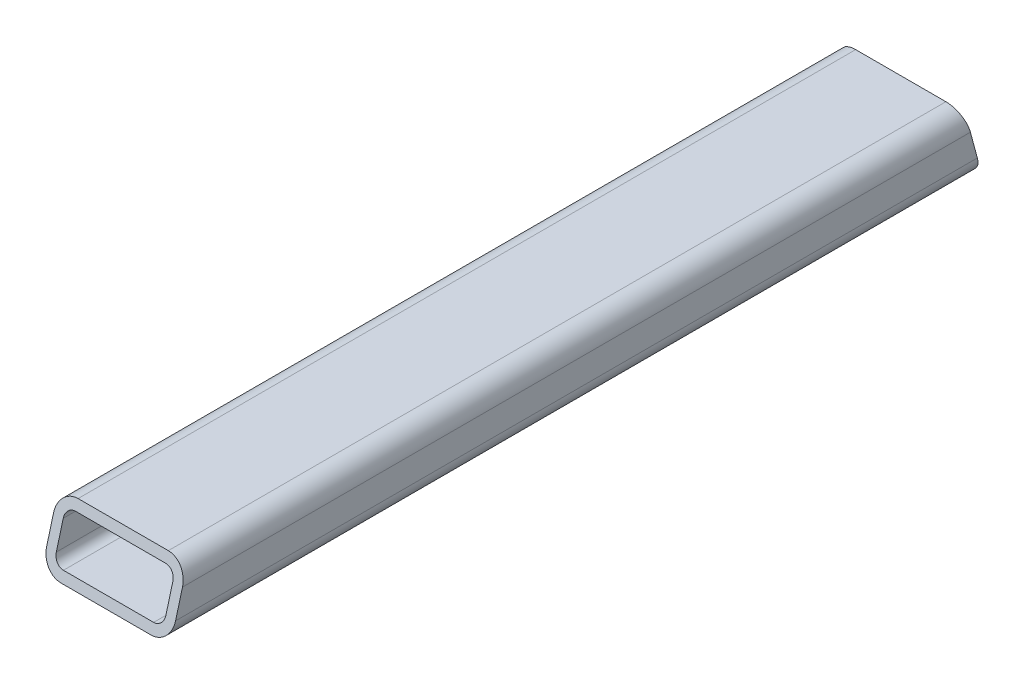
ISO-10303-21;
HEADER;
FILE_DESCRIPTION(('STEP AP214'),'2;1');
FILE_NAME('part.step','',(''),(''),'','','');
FILE_SCHEMA(('AUTOMOTIVE_DESIGN { 1 0 10303 214 1 1 1 1 }'));
ENDSEC;
DATA;
#1=APPLICATION_CONTEXT('core data for automotive mechanical design processes');
#2=APPLICATION_PROTOCOL_DEFINITION('international standard','automotive_design',2000,#1);
#3=PRODUCT_CONTEXT('',#1,'mechanical');
#4=PRODUCT('Part','Part','',(#3));
#5=PRODUCT_RELATED_PRODUCT_CATEGORY('part','',(#4));
#6=PRODUCT_DEFINITION_FORMATION('','',#4);
#7=PRODUCT_DEFINITION_CONTEXT('part definition',#1,'design');
#8=PRODUCT_DEFINITION('design','',#6,#7);
#9=PRODUCT_DEFINITION_SHAPE('','',#8);
#10=(LENGTH_UNIT() NAMED_UNIT(*) SI_UNIT(.MILLI.,.METRE.));
#11=(NAMED_UNIT(*) PLANE_ANGLE_UNIT() SI_UNIT($,.RADIAN.));
#12=(NAMED_UNIT(*) SI_UNIT($,.STERADIAN.) SOLID_ANGLE_UNIT());
#13=UNCERTAINTY_MEASURE_WITH_UNIT(LENGTH_MEASURE(1.E-05),#10,'distance_accuracy_value','');
#14=(GEOMETRIC_REPRESENTATION_CONTEXT(3) GLOBAL_UNCERTAINTY_ASSIGNED_CONTEXT((#13)) GLOBAL_UNIT_ASSIGNED_CONTEXT((#10,
#11,#12)) REPRESENTATION_CONTEXT('',''));
#15=CARTESIAN_POINT('',(0.,0.,0.));
#16=DIRECTION('',(0.,0.,1.));
#17=DIRECTION('',(1.,0.,0.));
#18=AXIS2_PLACEMENT_3D('',#15,#16,#17);
#19=CARTESIAN_POINT('',(14.,-4.,-126.));
#20=DIRECTION('',(0.,0.,1.));
#21=DIRECTION('',(1.,0.,0.));
#22=AXIS2_PLACEMENT_3D('',#19,#20,#21);
#23=CYLINDRICAL_SURFACE('',#22,6.);
#24=DIRECTION('',(0.,0.,1.));
#25=VECTOR('',#24,1.);
#26=CARTESIAN_POINT('',(14.,-10.,-126.));
#27=LINE('',#26,#25);
#28=CARTESIAN_POINT('',(14.,-10.,-126.));
#29=VERTEX_POINT('',#28);
#30=CARTESIAN_POINT('',(14.,-10.,126.));
#31=VERTEX_POINT('',#30);
#32=EDGE_CURVE('E129',#29,#31,#27,.T.);
#33=ORIENTED_EDGE('',*,*,#32,.F.);
#34=CARTESIAN_POINT('',(14.,-4.,-124.392304845413));
#35=DIRECTION('',(0.,0.258819045102517,-0.965925826289069));
#36=DIRECTION('',(0.,0.965925826289069,0.258819045102518));
#37=AXIS2_PLACEMENT_3D('',#34,#35,#36);
#38=ELLIPSE('',#37,6.21165708246049,6.);
#39=CARTESIAN_POINT('',(20.,-3.99999999999996,-124.392304845413));
#40=VERTEX_POINT('',#39);
#41=EDGE_CURVE('E169',#29,#40,#38,.F.);
#42=ORIENTED_EDGE('',*,*,#41,.T.);
#43=DIRECTION('',(0.,0.,1.));
#44=VECTOR('',#43,1.);
#45=CARTESIAN_POINT('',(20.,-3.99999999999996,-126.));
#46=LINE('',#45,#44);
#47=CARTESIAN_POINT('',(20.,-3.99999999999996,124.392304845413));
#48=VERTEX_POINT('',#47);
#49=EDGE_CURVE('E161',#40,#48,#46,.T.);
#50=ORIENTED_EDGE('',*,*,#49,.T.);
#51=CARTESIAN_POINT('',(14.,-4.,124.392304845413));
#52=DIRECTION('',(0.,-0.258819045102518,-0.965925826289069));
#53=DIRECTION('',(0.,-0.965925826289069,0.258819045102518));
#54=AXIS2_PLACEMENT_3D('',#51,#52,#53);
#55=ELLIPSE('',#54,6.21165708246049,6.);
#56=EDGE_CURVE('E171',#48,#31,#55,.T.);
#57=ORIENTED_EDGE('',*,*,#56,.T.);
#58=EDGE_LOOP('',(#33,#42,#50,#57));
#59=FACE_BOUND('',#58,.T.);
#60=ADVANCED_FACE('F43',(#59),#23,.T.);
#61=CARTESIAN_POINT('',(-14.,-10.,-126.));
#62=DIRECTION('',(0.,-1.,0.));
#63=DIRECTION('',(0.,0.,-1.));
#64=AXIS2_PLACEMENT_3D('',#61,#62,#63);
#65=PLANE('',#64);
#66=ORIENTED_EDGE('',*,*,#32,.T.);
#67=DIRECTION('',(1.,0.,0.));
#68=VECTOR('',#67,1.);
#69=CARTESIAN_POINT('',(-14.,-10.,126.));
#70=LINE('',#69,#68);
#71=CARTESIAN_POINT('',(-14.,-10.,126.));
#72=VERTEX_POINT('',#71);
#73=EDGE_CURVE('E177',#72,#31,#70,.T.);
#74=ORIENTED_EDGE('',*,*,#73,.F.);
#75=DIRECTION('',(0.,0.,1.));
#76=VECTOR('',#75,1.);
#77=CARTESIAN_POINT('',(-14.,-10.,-126.));
#78=LINE('',#77,#76);
#79=CARTESIAN_POINT('',(-14.,-10.,-126.));
#80=VERTEX_POINT('',#79);
#81=EDGE_CURVE('E264',#80,#72,#78,.T.);
#82=ORIENTED_EDGE('',*,*,#81,.F.);
#83=DIRECTION('',(1.,0.,0.));
#84=VECTOR('',#83,1.);
#85=CARTESIAN_POINT('',(-14.,-10.,-126.));
#86=LINE('',#85,#84);
#87=EDGE_CURVE('E173',#80,#29,#86,.T.);
#88=ORIENTED_EDGE('',*,*,#87,.T.);
#89=EDGE_LOOP('',(#66,#74,#82,#88));
#90=FACE_BOUND('',#89,.T.);
#91=ADVANCED_FACE('F314',(#90),#65,.T.);
#92=CARTESIAN_POINT('',(-14.,-4.,-126.));
#93=DIRECTION('',(0.,0.,1.));
#94=DIRECTION('',(1.,0.,0.));
#95=AXIS2_PLACEMENT_3D('',#92,#93,#94);
#96=CYLINDRICAL_SURFACE('',#95,6.);
#97=DIRECTION('',(0.,0.,1.));
#98=VECTOR('',#97,1.);
#99=CARTESIAN_POINT('',(-20.,-3.99999999999996,-126.));
#100=LINE('',#99,#98);
#101=CARTESIAN_POINT('',(-20.,-3.99999999999996,-124.392304845413));
#102=VERTEX_POINT('',#101);
#103=CARTESIAN_POINT('',(-20.,-3.99999999999996,124.392304845413));
#104=VERTEX_POINT('',#103);
#105=EDGE_CURVE('E270',#102,#104,#100,.T.);
#106=ORIENTED_EDGE('',*,*,#105,.F.);
#107=CARTESIAN_POINT('',(-14.,-4.,-124.392304845413));
#108=DIRECTION('',(0.,0.258819045102517,-0.965925826289069));
#109=DIRECTION('',(0.,0.965925826289069,0.258819045102518));
#110=AXIS2_PLACEMENT_3D('',#107,#108,#109);
#111=ELLIPSE('',#110,6.21165708246049,6.);
#112=EDGE_CURVE('E179',#102,#80,#111,.F.);
#113=ORIENTED_EDGE('',*,*,#112,.T.);
#114=ORIENTED_EDGE('',*,*,#81,.T.);
#115=CARTESIAN_POINT('',(-14.,-4.,124.392304845413));
#116=DIRECTION('',(0.,-0.258819045102518,-0.965925826289069));
#117=DIRECTION('',(0.,-0.965925826289069,0.258819045102518));
#118=AXIS2_PLACEMENT_3D('',#115,#116,#117);
#119=ELLIPSE('',#118,6.21165708246049,6.);
#120=EDGE_CURVE('E182',#72,#104,#119,.T.);
#121=ORIENTED_EDGE('',*,*,#120,.T.);
#122=EDGE_LOOP('',(#106,#113,#114,#121));
#123=FACE_BOUND('',#122,.T.);
#124=ADVANCED_FACE('F292',(#123),#96,.T.);
#125=CARTESIAN_POINT('',(-20.,3.99999999999996,-126.));
#126=DIRECTION('',(-1.,0.,0.));
#127=DIRECTION('',(0.,0.,1.));
#128=AXIS2_PLACEMENT_3D('',#125,#126,#127);
#129=PLANE('',#128);
#130=DIRECTION('',(0.,0.,1.));
#131=VECTOR('',#130,1.);
#132=CARTESIAN_POINT('',(-20.,3.99999999999996,-126.));
#133=LINE('',#132,#131);
#134=CARTESIAN_POINT('',(-20.,3.99999999999996,-122.248711305964));
#135=VERTEX_POINT('',#134);
#136=CARTESIAN_POINT('',(-20.,3.99999999999996,122.248711305964));
#137=VERTEX_POINT('',#136);
#138=EDGE_CURVE('E269',#135,#137,#133,.T.);
#139=ORIENTED_EDGE('',*,*,#138,.F.);
#140=DIRECTION('',(0.,-0.965925826289069,-0.258819045102518));
#141=VECTOR('',#140,1.);
#142=CARTESIAN_POINT('',(-20.,3.06217782649103,-122.5));
#143=LINE('',#142,#141);
#144=EDGE_CURVE('E288',#135,#102,#143,.T.);
#145=ORIENTED_EDGE('',*,*,#144,.T.);
#146=ORIENTED_EDGE('',*,*,#105,.T.);
#147=DIRECTION('',(0.,-0.965925826289069,0.258819045102518));
#148=VECTOR('',#147,1.);
#149=CARTESIAN_POINT('',(-20.,66.0621778264904,105.61920087684));
#150=LINE('',#149,#148);
#151=EDGE_CURVE('E290',#104,#137,#150,.F.);
#152=ORIENTED_EDGE('',*,*,#151,.T.);
#153=EDGE_LOOP('',(#139,#145,#146,#152));
#154=FACE_BOUND('',#153,.T.);
#155=ADVANCED_FACE('F296',(#154),#129,.T.);
#156=CARTESIAN_POINT('',(-14.,4.,-126.));
#157=DIRECTION('',(0.,0.,1.));
#158=DIRECTION('',(1.,0.,0.));
#159=AXIS2_PLACEMENT_3D('',#156,#157,#158);
#160=CYLINDRICAL_SURFACE('',#159,6.);
#161=DIRECTION('',(0.,0.,1.));
#162=VECTOR('',#161,1.);
#163=CARTESIAN_POINT('',(-14.,10.,-126.));
#164=LINE('',#163,#162);
#165=CARTESIAN_POINT('',(-14.,10.,-120.641016151378));
#166=VERTEX_POINT('',#165);
#167=CARTESIAN_POINT('',(-14.,10.,120.641016151378));
#168=VERTEX_POINT('',#167);
#169=EDGE_CURVE('E271',#166,#168,#164,.T.);
#170=ORIENTED_EDGE('',*,*,#169,.F.);
#171=CARTESIAN_POINT('',(-14.,4.,-122.248711305964));
#172=DIRECTION('',(0.,0.258819045102517,-0.965925826289069));
#173=DIRECTION('',(0.,0.965925826289069,0.258819045102518));
#174=AXIS2_PLACEMENT_3D('',#171,#172,#173);
#175=ELLIPSE('',#174,6.21165708246049,6.);
#176=EDGE_CURVE('E282',#166,#135,#175,.F.);
#177=ORIENTED_EDGE('',*,*,#176,.T.);
#178=ORIENTED_EDGE('',*,*,#138,.T.);
#179=CARTESIAN_POINT('',(-14.,4.,122.248711305964));
#180=DIRECTION('',(0.,-0.258819045102518,-0.965925826289069));
#181=DIRECTION('',(0.,-0.965925826289069,0.258819045102518));
#182=AXIS2_PLACEMENT_3D('',#179,#180,#181);
#183=ELLIPSE('',#182,6.21165708246049,6.);
#184=EDGE_CURVE('E281',#137,#168,#183,.T.);
#185=ORIENTED_EDGE('',*,*,#184,.T.);
#186=EDGE_LOOP('',(#170,#177,#178,#185));
#187=FACE_BOUND('',#186,.T.);
#188=ADVANCED_FACE('F302',(#187),#160,.T.);
#189=CARTESIAN_POINT('',(-14.,10.,-126.));
#190=DIRECTION('',(0.,1.,0.));
#191=DIRECTION('',(0.,0.,1.));
#192=AXIS2_PLACEMENT_3D('',#189,#190,#191);
#193=PLANE('',#192);
#194=DIRECTION('',(0.,0.,1.));
#195=VECTOR('',#194,1.);
#196=CARTESIAN_POINT('',(14.,10.,-126.));
#197=LINE('',#196,#195);
#198=CARTESIAN_POINT('',(14.,10.,-120.641016151378));
#199=VERTEX_POINT('',#198);
#200=CARTESIAN_POINT('',(14.,10.,120.641016151378));
#201=VERTEX_POINT('',#200);
#202=EDGE_CURVE('E279',#199,#201,#197,.T.);
#203=ORIENTED_EDGE('',*,*,#202,.F.);
#204=DIRECTION('',(-1.,0.,0.));
#205=VECTOR('',#204,1.);
#206=CARTESIAN_POINT('',(-14.,10.,-120.641016151378));
#207=LINE('',#206,#205);
#208=EDGE_CURVE('E277',#199,#166,#207,.T.);
#209=ORIENTED_EDGE('',*,*,#208,.T.);
#210=ORIENTED_EDGE('',*,*,#169,.T.);
#211=DIRECTION('',(1.,0.,0.));
#212=VECTOR('',#211,1.);
#213=CARTESIAN_POINT('',(-14.,10.,120.641016151378));
#214=LINE('',#213,#212);
#215=EDGE_CURVE('E261',#168,#201,#214,.T.);
#216=ORIENTED_EDGE('',*,*,#215,.T.);
#217=EDGE_LOOP('',(#203,#209,#210,#216));
#218=FACE_BOUND('',#217,.T.);
#219=ADVANCED_FACE('F310',(#218),#193,.T.);
#220=CARTESIAN_POINT('',(14.,4.,-126.));
#221=DIRECTION('',(0.,0.,1.));
#222=DIRECTION('',(1.,0.,0.));
#223=AXIS2_PLACEMENT_3D('',#220,#221,#222);
#224=CYLINDRICAL_SURFACE('',#223,6.);
#225=DIRECTION('',(0.,0.,1.));
#226=VECTOR('',#225,1.);
#227=CARTESIAN_POINT('',(20.,3.99999999999996,-126.));
#228=LINE('',#227,#226);
#229=CARTESIAN_POINT('',(20.,3.99999999999996,-122.248711305964));
#230=VERTEX_POINT('',#229);
#231=CARTESIAN_POINT('',(20.,3.99999999999996,122.248711305964));
#232=VERTEX_POINT('',#231);
#233=EDGE_CURVE('E164',#230,#232,#228,.T.);
#234=ORIENTED_EDGE('',*,*,#233,.F.);
#235=CARTESIAN_POINT('',(14.,4.,-122.248711305964));
#236=DIRECTION('',(0.,0.258819045102517,-0.965925826289069));
#237=DIRECTION('',(0.,0.965925826289069,0.258819045102518));
#238=AXIS2_PLACEMENT_3D('',#235,#236,#237);
#239=ELLIPSE('',#238,6.21165708246049,6.);
#240=EDGE_CURVE('E11',#230,#199,#239,.F.);
#241=ORIENTED_EDGE('',*,*,#240,.T.);
#242=ORIENTED_EDGE('',*,*,#202,.T.);
#243=CARTESIAN_POINT('',(14.,4.,122.248711305964));
#244=DIRECTION('',(0.,-0.258819045102518,-0.965925826289069));
#245=DIRECTION('',(0.,-0.965925826289069,0.258819045102518));
#246=AXIS2_PLACEMENT_3D('',#243,#244,#245);
#247=ELLIPSE('',#246,6.21165708246049,6.);
#248=EDGE_CURVE('E53',#201,#232,#247,.T.);
#249=ORIENTED_EDGE('',*,*,#248,.T.);
#250=EDGE_LOOP('',(#234,#241,#242,#249));
#251=FACE_BOUND('',#250,.T.);
#252=ADVANCED_FACE('F320',(#251),#224,.T.);
#253=CARTESIAN_POINT('',(20.,3.99999999999996,-126.));
#254=DIRECTION('',(1.,0.,0.));
#255=DIRECTION('',(0.,0.,-1.));
#256=AXIS2_PLACEMENT_3D('',#253,#254,#255);
#257=PLANE('',#256);
#258=ORIENTED_EDGE('',*,*,#49,.F.);
#259=DIRECTION('',(0.,0.965925826289069,0.258819045102518));
#260=VECTOR('',#259,1.);
#261=CARTESIAN_POINT('',(20.,3.06217782649103,-122.5));
#262=LINE('',#261,#260);
#263=EDGE_CURVE('E166',#40,#230,#262,.T.);
#264=ORIENTED_EDGE('',*,*,#263,.T.);
#265=ORIENTED_EDGE('',*,*,#233,.T.);
#266=DIRECTION('',(0.,0.965925826289069,-0.258819045102518));
#267=VECTOR('',#266,1.);
#268=CARTESIAN_POINT('',(20.,66.0621778264904,105.61920087684));
#269=LINE('',#268,#267);
#270=EDGE_CURVE('E159',#232,#48,#269,.F.);
#271=ORIENTED_EDGE('',*,*,#270,.T.);
#272=EDGE_LOOP('',(#258,#264,#265,#271));
#273=FACE_BOUND('',#272,.T.);
#274=ADVANCED_FACE('F162',(#273),#257,.T.);
#275=CARTESIAN_POINT('',(14.,-4.,-126.));
#276=DIRECTION('',(0.,0.,1.));
#277=DIRECTION('',(1.,0.,0.));
#278=AXIS2_PLACEMENT_3D('',#275,#276,#277);
#279=CYLINDRICAL_SURFACE('',#278,3.);
#280=DIRECTION('',(0.,0.,1.));
#281=VECTOR('',#280,1.);
#282=CARTESIAN_POINT('',(17.,-3.99999999999998,-126.));
#283=LINE('',#282,#281);
#284=CARTESIAN_POINT('',(17.,-3.99999999999998,-124.392304845413));
#285=VERTEX_POINT('',#284);
#286=CARTESIAN_POINT('',(17.,-3.99999999999998,124.392304845413));
#287=VERTEX_POINT('',#286);
#288=EDGE_CURVE('E191',#285,#287,#283,.T.);
#289=ORIENTED_EDGE('',*,*,#288,.F.);
#290=CARTESIAN_POINT('',(14.,-4.,-124.392304845413));
#291=DIRECTION('',(0.,0.258819045102517,-0.965925826289069));
#292=DIRECTION('',(0.,0.965925826289069,0.258819045102518));
#293=AXIS2_PLACEMENT_3D('',#290,#291,#292);
#294=ELLIPSE('',#293,3.10582854123024,3.);
#295=CARTESIAN_POINT('',(14.,-7.,-125.196152422707));
#296=VERTEX_POINT('',#295);
#297=EDGE_CURVE('E214',#296,#285,#294,.F.);
#298=ORIENTED_EDGE('',*,*,#297,.F.);
#299=DIRECTION('',(0.,0.,-1.));
#300=VECTOR('',#299,1.);
#301=CARTESIAN_POINT('',(14.,-7.,-126.));
#302=LINE('',#301,#300);
#303=CARTESIAN_POINT('',(14.,-7.,125.196152422707));
#304=VERTEX_POINT('',#303);
#305=EDGE_CURVE('E238',#296,#304,#302,.F.);
#306=ORIENTED_EDGE('',*,*,#305,.T.);
#307=CARTESIAN_POINT('',(14.,-4.,124.392304845413));
#308=DIRECTION('',(0.,-0.258819045102518,-0.965925826289069));
#309=DIRECTION('',(0.,-0.965925826289069,0.258819045102518));
#310=AXIS2_PLACEMENT_3D('',#307,#308,#309);
#311=ELLIPSE('',#310,3.10582854123025,3.);
#312=EDGE_CURVE('E213',#304,#287,#311,.F.);
#313=ORIENTED_EDGE('',*,*,#312,.T.);
#314=EDGE_LOOP('',(#289,#298,#306,#313));
#315=FACE_BOUND('',#314,.T.);
#316=ADVANCED_FACE('F242',(#315),#279,.F.);
#317=CARTESIAN_POINT('',(-14.,-7.,-126.));
#318=DIRECTION('',(0.,-1.,0.));
#319=DIRECTION('',(0.,0.,-1.));
#320=AXIS2_PLACEMENT_3D('',#317,#318,#319);
#321=PLANE('',#320);
#322=ORIENTED_EDGE('',*,*,#305,.F.);
#323=DIRECTION('',(1.,0.,0.));
#324=VECTOR('',#323,1.);
#325=CARTESIAN_POINT('',(-14.,-7.,-125.196152422707));
#326=LINE('',#325,#324);
#327=CARTESIAN_POINT('',(-14.,-7.,-125.196152422707));
#328=VERTEX_POINT('',#327);
#329=EDGE_CURVE('E186',#328,#296,#326,.T.);
#330=ORIENTED_EDGE('',*,*,#329,.F.);
#331=DIRECTION('',(0.,0.,1.));
#332=VECTOR('',#331,1.);
#333=CARTESIAN_POINT('',(-14.,-7.,-126.));
#334=LINE('',#333,#332);
#335=CARTESIAN_POINT('',(-14.,-7.,125.196152422707));
#336=VERTEX_POINT('',#335);
#337=EDGE_CURVE('E239',#328,#336,#334,.T.);
#338=ORIENTED_EDGE('',*,*,#337,.T.);
#339=DIRECTION('',(-1.,0.,0.));
#340=VECTOR('',#339,1.);
#341=CARTESIAN_POINT('',(14.,-7.,125.196152422707));
#342=LINE('',#341,#340);
#343=EDGE_CURVE('E48',#336,#304,#342,.F.);
#344=ORIENTED_EDGE('',*,*,#343,.T.);
#345=EDGE_LOOP('',(#322,#330,#338,#344));
#346=FACE_BOUND('',#345,.T.);
#347=ADVANCED_FACE('F232',(#346),#321,.F.);
#348=CARTESIAN_POINT('',(-14.,-4.,-126.));
#349=DIRECTION('',(0.,0.,1.));
#350=DIRECTION('',(1.,0.,0.));
#351=AXIS2_PLACEMENT_3D('',#348,#349,#350);
#352=CYLINDRICAL_SURFACE('',#351,3.);
#353=ORIENTED_EDGE('',*,*,#337,.F.);
#354=CARTESIAN_POINT('',(-14.,-4.,-124.392304845413));
#355=DIRECTION('',(0.,0.258819045102517,-0.965925826289069));
#356=DIRECTION('',(0.,0.965925826289069,0.258819045102518));
#357=AXIS2_PLACEMENT_3D('',#354,#355,#356);
#358=ELLIPSE('',#357,3.10582854123025,3.);
#359=CARTESIAN_POINT('',(-17.,-3.99999999999996,-124.392304845413));
#360=VERTEX_POINT('',#359);
#361=EDGE_CURVE('E195',#360,#328,#358,.F.);
#362=ORIENTED_EDGE('',*,*,#361,.F.);
#363=DIRECTION('',(0.,0.,1.));
#364=VECTOR('',#363,1.);
#365=CARTESIAN_POINT('',(-17.,-3.99999999999996,-126.));
#366=LINE('',#365,#364);
#367=CARTESIAN_POINT('',(-17.,-3.99999999999996,124.392304845413));
#368=VERTEX_POINT('',#367);
#369=EDGE_CURVE('E247',#360,#368,#366,.T.);
#370=ORIENTED_EDGE('',*,*,#369,.T.);
#371=CARTESIAN_POINT('',(-14.,-4.,124.392304845413));
#372=DIRECTION('',(0.,-0.258819045102518,-0.965925826289069));
#373=DIRECTION('',(0.,-0.965925826289069,0.258819045102518));
#374=AXIS2_PLACEMENT_3D('',#371,#372,#373);
#375=ELLIPSE('',#374,3.10582854123025,3.);
#376=EDGE_CURVE('E120',#368,#336,#375,.F.);
#377=ORIENTED_EDGE('',*,*,#376,.T.);
#378=EDGE_LOOP('',(#353,#362,#370,#377));
#379=FACE_BOUND('',#378,.T.);
#380=ADVANCED_FACE('F392',(#379),#352,.F.);
#381=CARTESIAN_POINT('',(-17.,3.99999999999996,-126.));
#382=DIRECTION('',(-1.,0.,0.));
#383=DIRECTION('',(0.,0.,1.));
#384=AXIS2_PLACEMENT_3D('',#381,#382,#383);
#385=PLANE('',#384);
#386=ORIENTED_EDGE('',*,*,#369,.F.);
#387=DIRECTION('',(0.,-0.965925826289069,-0.258819045102518));
#388=VECTOR('',#387,1.);
#389=CARTESIAN_POINT('',(-17.,3.06217782649103,-122.5));
#390=LINE('',#389,#388);
#391=CARTESIAN_POINT('',(-17.,3.99999999999998,-122.248711305964));
#392=VERTEX_POINT('',#391);
#393=EDGE_CURVE('E198',#392,#360,#390,.T.);
#394=ORIENTED_EDGE('',*,*,#393,.F.);
#395=DIRECTION('',(0.,0.,1.));
#396=VECTOR('',#395,1.);
#397=CARTESIAN_POINT('',(-17.,3.99999999999998,-126.));
#398=LINE('',#397,#396);
#399=CARTESIAN_POINT('',(-17.,3.99999999999998,122.248711305964));
#400=VERTEX_POINT('',#399);
#401=EDGE_CURVE('E254',#392,#400,#398,.T.);
#402=ORIENTED_EDGE('',*,*,#401,.T.);
#403=DIRECTION('',(0.,0.965925826289069,-0.258819045102518));
#404=VECTOR('',#403,1.);
#405=CARTESIAN_POINT('',(-17.,-10.0000000000003,126.));
#406=LINE('',#405,#404);
#407=EDGE_CURVE('E230',#400,#368,#406,.F.);
#408=ORIENTED_EDGE('',*,*,#407,.T.);
#409=EDGE_LOOP('',(#386,#394,#402,#408));
#410=FACE_BOUND('',#409,.T.);
#411=ADVANCED_FACE('F404',(#410),#385,.F.);
#412=CARTESIAN_POINT('',(-14.,4.,-126.));
#413=DIRECTION('',(0.,0.,1.));
#414=DIRECTION('',(1.,0.,0.));
#415=AXIS2_PLACEMENT_3D('',#412,#413,#414);
#416=CYLINDRICAL_SURFACE('',#415,3.);
#417=ORIENTED_EDGE('',*,*,#401,.F.);
#418=CARTESIAN_POINT('',(-14.,4.,-122.248711305964));
#419=DIRECTION('',(0.,0.258819045102517,-0.965925826289069));
#420=DIRECTION('',(0.,0.965925826289069,0.258819045102518));
#421=AXIS2_PLACEMENT_3D('',#418,#419,#420);
#422=ELLIPSE('',#421,3.10582854123024,3.);
#423=CARTESIAN_POINT('',(-14.,7.,-121.444863728671));
#424=VERTEX_POINT('',#423);
#425=EDGE_CURVE('E199',#424,#392,#422,.F.);
#426=ORIENTED_EDGE('',*,*,#425,.F.);
#427=DIRECTION('',(0.,0.,1.));
#428=VECTOR('',#427,1.);
#429=CARTESIAN_POINT('',(-14.,7.,-126.));
#430=LINE('',#429,#428);
#431=CARTESIAN_POINT('',(-14.,7.,121.444863728671));
#432=VERTEX_POINT('',#431);
#433=EDGE_CURVE('E253',#424,#432,#430,.T.);
#434=ORIENTED_EDGE('',*,*,#433,.T.);
#435=CARTESIAN_POINT('',(-14.,4.,122.248711305964));
#436=DIRECTION('',(0.,-0.258819045102518,-0.965925826289069));
#437=DIRECTION('',(0.,-0.965925826289069,0.258819045102518));
#438=AXIS2_PLACEMENT_3D('',#435,#436,#437);
#439=ELLIPSE('',#438,3.10582854123025,3.);
#440=EDGE_CURVE('E228',#432,#400,#439,.F.);
#441=ORIENTED_EDGE('',*,*,#440,.T.);
#442=EDGE_LOOP('',(#417,#426,#434,#441));
#443=FACE_BOUND('',#442,.T.);
#444=ADVANCED_FACE('F411',(#443),#416,.F.);
#445=CARTESIAN_POINT('',(-14.,7.,-126.));
#446=DIRECTION('',(0.,1.,0.));
#447=DIRECTION('',(0.,0.,1.));
#448=AXIS2_PLACEMENT_3D('',#445,#446,#447);
#449=PLANE('',#448);
#450=ORIENTED_EDGE('',*,*,#433,.F.);
#451=DIRECTION('',(-1.,0.,0.));
#452=VECTOR('',#451,1.);
#453=CARTESIAN_POINT('',(-14.,7.,-121.444863728671));
#454=LINE('',#453,#452);
#455=CARTESIAN_POINT('',(14.,7.,-121.444863728671));
#456=VERTEX_POINT('',#455);
#457=EDGE_CURVE('E205',#456,#424,#454,.T.);
#458=ORIENTED_EDGE('',*,*,#457,.F.);
#459=DIRECTION('',(0.,0.,1.));
#460=VECTOR('',#459,1.);
#461=CARTESIAN_POINT('',(14.,7.,-126.));
#462=LINE('',#461,#460);
#463=CARTESIAN_POINT('',(14.,7.,121.444863728671));
#464=VERTEX_POINT('',#463);
#465=EDGE_CURVE('E256',#456,#464,#462,.T.);
#466=ORIENTED_EDGE('',*,*,#465,.T.);
#467=DIRECTION('',(1.,0.,0.));
#468=VECTOR('',#467,1.);
#469=CARTESIAN_POINT('',(14.,7.,121.444863728671));
#470=LINE('',#469,#468);
#471=EDGE_CURVE('E222',#464,#432,#470,.F.);
#472=ORIENTED_EDGE('',*,*,#471,.T.);
#473=EDGE_LOOP('',(#450,#458,#466,#472));
#474=FACE_BOUND('',#473,.T.);
#475=ADVANCED_FACE('F350',(#474),#449,.F.);
#476=CARTESIAN_POINT('',(14.,4.,-126.));
#477=DIRECTION('',(0.,0.,1.));
#478=DIRECTION('',(1.,0.,0.));
#479=AXIS2_PLACEMENT_3D('',#476,#477,#478);
#480=CYLINDRICAL_SURFACE('',#479,3.);
#481=ORIENTED_EDGE('',*,*,#465,.F.);
#482=CARTESIAN_POINT('',(14.,4.,-122.248711305964));
#483=DIRECTION('',(0.,0.258819045102517,-0.965925826289069));
#484=DIRECTION('',(0.,0.965925826289069,0.258819045102518));
#485=AXIS2_PLACEMENT_3D('',#482,#483,#484);
#486=ELLIPSE('',#485,3.10582854123025,3.);
#487=CARTESIAN_POINT('',(17.,3.99999999999996,-122.248711305964));
#488=VERTEX_POINT('',#487);
#489=EDGE_CURVE('E204',#488,#456,#486,.F.);
#490=ORIENTED_EDGE('',*,*,#489,.F.);
#491=DIRECTION('',(0.,0.,-1.));
#492=VECTOR('',#491,1.);
#493=CARTESIAN_POINT('',(17.,3.99999999999996,-126.));
#494=LINE('',#493,#492);
#495=CARTESIAN_POINT('',(17.,3.99999999999996,122.248711305964));
#496=VERTEX_POINT('',#495);
#497=EDGE_CURVE('E258',#488,#496,#494,.F.);
#498=ORIENTED_EDGE('',*,*,#497,.T.);
#499=CARTESIAN_POINT('',(14.,4.,122.248711305964));
#500=DIRECTION('',(0.,-0.258819045102518,-0.965925826289069));
#501=DIRECTION('',(0.,-0.965925826289069,0.258819045102518));
#502=AXIS2_PLACEMENT_3D('',#499,#500,#501);
#503=ELLIPSE('',#502,3.10582854123025,3.);
#504=EDGE_CURVE('E217',#496,#464,#503,.F.);
#505=ORIENTED_EDGE('',*,*,#504,.T.);
#506=EDGE_LOOP('',(#481,#490,#498,#505));
#507=FACE_BOUND('',#506,.T.);
#508=ADVANCED_FACE('F344',(#507),#480,.F.);
#509=CARTESIAN_POINT('',(17.,3.99999999999996,-126.));
#510=DIRECTION('',(1.,0.,0.));
#511=DIRECTION('',(0.,0.,-1.));
#512=AXIS2_PLACEMENT_3D('',#509,#510,#511);
#513=PLANE('',#512);
#514=ORIENTED_EDGE('',*,*,#497,.F.);
#515=DIRECTION('',(0.,0.965925826289069,0.258819045102518));
#516=VECTOR('',#515,1.);
#517=CARTESIAN_POINT('',(17.,3.06217782649103,-122.5));
#518=LINE('',#517,#516);
#519=EDGE_CURVE('E206',#285,#488,#518,.T.);
#520=ORIENTED_EDGE('',*,*,#519,.F.);
#521=ORIENTED_EDGE('',*,*,#288,.T.);
#522=DIRECTION('',(0.,-0.965925826289069,0.258819045102518));
#523=VECTOR('',#522,1.);
#524=CARTESIAN_POINT('',(17.,-10.0000000000003,126.));
#525=LINE('',#524,#523);
#526=EDGE_CURVE('E220',#287,#496,#525,.F.);
#527=ORIENTED_EDGE('',*,*,#526,.T.);
#528=EDGE_LOOP('',(#514,#520,#521,#527));
#529=FACE_BOUND('',#528,.T.);
#530=ADVANCED_FACE('F337',(#529),#513,.F.);
#531=CARTESIAN_POINT('',(-14.,10.,-120.641016151378));
#532=DIRECTION('',(0.,0.258819045102517,-0.965925826289069));
#533=DIRECTION('',(1.,0.,0.));
#534=AXIS2_PLACEMENT_3D('',#531,#532,#533);
#535=PLANE('',#534);
#536=ORIENTED_EDGE('',*,*,#41,.F.);
#537=ORIENTED_EDGE('',*,*,#87,.F.);
#538=ORIENTED_EDGE('',*,*,#112,.F.);
#539=ORIENTED_EDGE('',*,*,#144,.F.);
#540=ORIENTED_EDGE('',*,*,#176,.F.);
#541=ORIENTED_EDGE('',*,*,#208,.F.);
#542=ORIENTED_EDGE('',*,*,#240,.F.);
#543=ORIENTED_EDGE('',*,*,#263,.F.);
#544=EDGE_LOOP('',(#536,#537,#538,#539,#540,#541,#542,#543));
#545=FACE_BOUND('',#544,.T.);
#546=ORIENTED_EDGE('',*,*,#329,.T.);
#547=ORIENTED_EDGE('',*,*,#297,.T.);
#548=ORIENTED_EDGE('',*,*,#519,.T.);
#549=ORIENTED_EDGE('',*,*,#489,.T.);
#550=ORIENTED_EDGE('',*,*,#457,.T.);
#551=ORIENTED_EDGE('',*,*,#425,.T.);
#552=ORIENTED_EDGE('',*,*,#393,.T.);
#553=ORIENTED_EDGE('',*,*,#361,.T.);
#554=EDGE_LOOP('',(#546,#547,#548,#549,#550,#551,#552,#553));
#555=FACE_BOUND('',#554,.T.);
#556=ADVANCED_FACE('F311',(#545,#555),#535,.T.);
#557=CARTESIAN_POINT('',(14.,-10.0000000000003,126.));
#558=DIRECTION('',(0.,-0.258819045102518,-0.965925826289069));
#559=DIRECTION('',(-1.,0.,0.));
#560=AXIS2_PLACEMENT_3D('',#557,#558,#559);
#561=PLANE('',#560);
#562=ORIENTED_EDGE('',*,*,#248,.F.);
#563=ORIENTED_EDGE('',*,*,#215,.F.);
#564=ORIENTED_EDGE('',*,*,#184,.F.);
#565=ORIENTED_EDGE('',*,*,#151,.F.);
#566=ORIENTED_EDGE('',*,*,#120,.F.);
#567=ORIENTED_EDGE('',*,*,#73,.T.);
#568=ORIENTED_EDGE('',*,*,#56,.F.);
#569=ORIENTED_EDGE('',*,*,#270,.F.);
#570=EDGE_LOOP('',(#562,#563,#564,#565,#566,#567,#568,#569));
#571=FACE_BOUND('',#570,.T.);
#572=ORIENTED_EDGE('',*,*,#312,.F.);
#573=ORIENTED_EDGE('',*,*,#343,.F.);
#574=ORIENTED_EDGE('',*,*,#376,.F.);
#575=ORIENTED_EDGE('',*,*,#407,.F.);
#576=ORIENTED_EDGE('',*,*,#440,.F.);
#577=ORIENTED_EDGE('',*,*,#471,.F.);
#578=ORIENTED_EDGE('',*,*,#504,.F.);
#579=ORIENTED_EDGE('',*,*,#526,.F.);
#580=EDGE_LOOP('',(#572,#573,#574,#575,#576,#577,#578,#579));
#581=FACE_BOUND('',#580,.T.);
#582=ADVANCED_FACE('F46',(#571,#581),#561,.F.);
#583=CLOSED_SHELL('',(#60,#91,#124,#155,#188,#219,#252,#274,#316,#347,#380,#411,#444,#475,#508,
#530,#556,#582));
#584=MANIFOLD_SOLID_BREP('B2',#583);
#585=ADVANCED_BREP_SHAPE_REPRESENTATION('',(#18,#584),#14);
#586=SHAPE_DEFINITION_REPRESENTATION(#9,#585);
ENDSEC;
END-ISO-10303-21;
